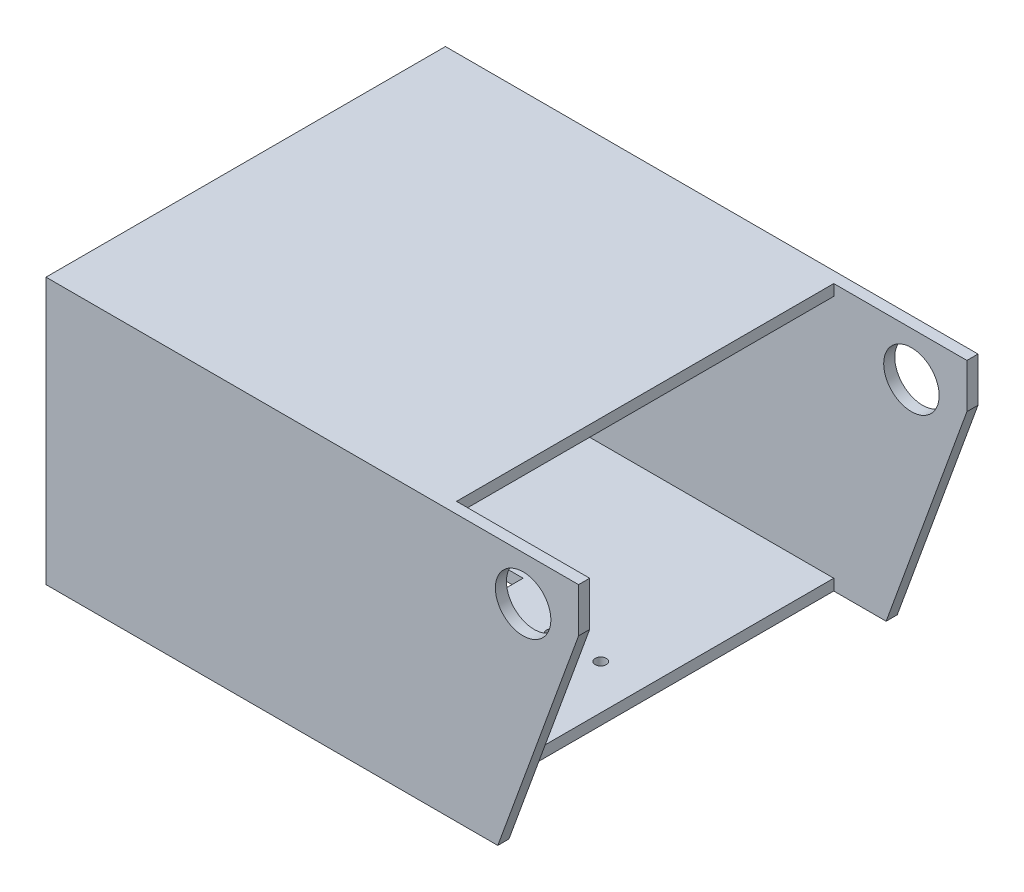
ISO-10303-21;
HEADER;
FILE_DESCRIPTION(('STEP AP214'),'2;1');
FILE_NAME('part.step','',(''),(''),'','','');
FILE_SCHEMA(('AUTOMOTIVE_DESIGN { 1 0 10303 214 1 1 1 1 }'));
ENDSEC;
DATA;
#1=APPLICATION_CONTEXT('core data for automotive mechanical design processes');
#2=APPLICATION_PROTOCOL_DEFINITION('international standard','automotive_design',2000,#1);
#3=PRODUCT_CONTEXT('',#1,'mechanical');
#4=PRODUCT('Part','Part','',(#3));
#5=PRODUCT_RELATED_PRODUCT_CATEGORY('part','',(#4));
#6=PRODUCT_DEFINITION_FORMATION('','',#4);
#7=PRODUCT_DEFINITION_CONTEXT('part definition',#1,'design');
#8=PRODUCT_DEFINITION('design','',#6,#7);
#9=PRODUCT_DEFINITION_SHAPE('','',#8);
#10=(LENGTH_UNIT() NAMED_UNIT(*) SI_UNIT(.MILLI.,.METRE.));
#11=(NAMED_UNIT(*) PLANE_ANGLE_UNIT() SI_UNIT($,.RADIAN.));
#12=(NAMED_UNIT(*) SI_UNIT($,.STERADIAN.) SOLID_ANGLE_UNIT());
#13=UNCERTAINTY_MEASURE_WITH_UNIT(LENGTH_MEASURE(1.E-05),#10,'distance_accuracy_value','');
#14=(GEOMETRIC_REPRESENTATION_CONTEXT(3) GLOBAL_UNCERTAINTY_ASSIGNED_CONTEXT((#13)) GLOBAL_UNIT_ASSIGNED_CONTEXT((#10,
#11,#12)) REPRESENTATION_CONTEXT('',''));
#15=CARTESIAN_POINT('',(0.,0.,0.));
#16=DIRECTION('',(0.,0.,1.));
#17=DIRECTION('',(1.,0.,0.));
#18=AXIS2_PLACEMENT_3D('',#15,#16,#17);
#19=CARTESIAN_POINT('',(17.18049689441,76.2,-41.5984161490683));
#20=DIRECTION('',(1.,0.,0.));
#21=DIRECTION('',(0.,0.,-1.));
#22=AXIS2_PLACEMENT_3D('',#19,#20,#21);
#23=PLANE('',#22);
#24=DIRECTION('',(0.,0.,1.));
#25=VECTOR('',#24,1.);
#26=CARTESIAN_POINT('',(17.18049689441,73.025,-41.5984161490683));
#27=LINE('',#26,#25);
#28=CARTESIAN_POINT('',(17.18049689441,73.025,-41.5984161490684));
#29=VERTEX_POINT('',#28);
#30=CARTESIAN_POINT('',(17.18049689441,73.025,66.3515838509316));
#31=VERTEX_POINT('',#30);
#32=EDGE_CURVE('E316',#29,#31,#27,.T.);
#33=ORIENTED_EDGE('',*,*,#32,.F.);
#34=DIRECTION('',(0.,-1.,0.));
#35=VECTOR('',#34,1.);
#36=CARTESIAN_POINT('',(17.18049689441,76.2,-41.5984161490683));
#37=LINE('',#36,#35);
#38=CARTESIAN_POINT('',(17.18049689441,76.2,-41.5984161490683));
#39=VERTEX_POINT('',#38);
#40=EDGE_CURVE('E252',#39,#29,#37,.T.);
#41=ORIENTED_EDGE('',*,*,#40,.F.);
#42=DIRECTION('',(0.,0.,1.));
#43=VECTOR('',#42,1.);
#44=CARTESIAN_POINT('',(17.18049689441,76.2,-41.5984161490683));
#45=LINE('',#44,#43);
#46=CARTESIAN_POINT('',(17.18049689441,76.2,66.3515838509317));
#47=VERTEX_POINT('',#46);
#48=EDGE_CURVE('E236',#39,#47,#45,.T.);
#49=ORIENTED_EDGE('',*,*,#48,.T.);
#50=DIRECTION('',(0.,-1.,0.));
#51=VECTOR('',#50,1.);
#52=CARTESIAN_POINT('',(17.18049689441,76.2,66.3515838509317));
#53=LINE('',#52,#51);
#54=EDGE_CURVE('E260',#47,#31,#53,.T.);
#55=ORIENTED_EDGE('',*,*,#54,.T.);
#56=EDGE_LOOP('',(#33,#41,#49,#55));
#57=FACE_BOUND('',#56,.T.);
#58=ADVANCED_FACE('F40',(#57),#23,.T.);
#59=CARTESIAN_POINT('',(55.2804968944099,76.2,-44.7734161490683));
#60=DIRECTION('',(-1.,0.,0.));
#61=DIRECTION('',(0.,0.,1.));
#62=AXIS2_PLACEMENT_3D('',#59,#60,#61);
#63=PLANE('',#62);
#64=DIRECTION('',(0.,-1.,0.));
#65=VECTOR('',#64,1.);
#66=CARTESIAN_POINT('',(55.28049689441,76.2,66.3515838509317));
#67=LINE('',#66,#65);
#68=CARTESIAN_POINT('',(55.28049689441,76.2,66.3515838509317));
#69=VERTEX_POINT('',#68);
#70=CARTESIAN_POINT('',(55.28049689441,63.5,66.3515838509317));
#71=VERTEX_POINT('',#70);
#72=EDGE_CURVE('E257',#69,#71,#67,.T.);
#73=ORIENTED_EDGE('',*,*,#72,.F.);
#74=DIRECTION('',(0.,0.,-1.));
#75=VECTOR('',#74,1.);
#76=CARTESIAN_POINT('',(55.2804968944099,76.2,-44.7734161490683));
#77=LINE('',#76,#75);
#78=CARTESIAN_POINT('',(55.28049689441,76.2,69.5265838509317));
#79=VERTEX_POINT('',#78);
#80=EDGE_CURVE('E285',#79,#69,#77,.T.);
#81=ORIENTED_EDGE('',*,*,#80,.F.);
#82=DIRECTION('',(0.,-1.,0.));
#83=VECTOR('',#82,1.);
#84=CARTESIAN_POINT('',(55.28049689441,76.2,69.5265838509317));
#85=LINE('',#84,#83);
#86=CARTESIAN_POINT('',(55.28049689441,63.5,69.5265838509317));
#87=VERTEX_POINT('',#86);
#88=EDGE_CURVE('E302',#79,#87,#85,.T.);
#89=ORIENTED_EDGE('',*,*,#88,.T.);
#90=DIRECTION('',(0.,0.,1.));
#91=VECTOR('',#90,1.);
#92=CARTESIAN_POINT('',(55.28049689441,63.5,-44.7734161490683));
#93=LINE('',#92,#91);
#94=EDGE_CURVE('E269',#71,#87,#93,.T.);
#95=ORIENTED_EDGE('',*,*,#94,.F.);
#96=EDGE_LOOP('',(#73,#81,#89,#95));
#97=FACE_BOUND('',#96,.T.);
#98=ADVANCED_FACE('F341',(#97),#63,.F.);
#99=CARTESIAN_POINT('',(0.,76.2,0.));
#100=DIRECTION('',(0.,1.,0.));
#101=DIRECTION('',(0.,0.,1.));
#102=AXIS2_PLACEMENT_3D('',#99,#100,#101);
#103=PLANE('',#102);
#104=ORIENTED_EDGE('',*,*,#80,.T.);
#105=DIRECTION('',(1.,0.,0.));
#106=VECTOR('',#105,1.);
#107=CARTESIAN_POINT('',(17.18049689441,76.2,66.3515838509317));
#108=LINE('',#107,#106);
#109=EDGE_CURVE('E238',#47,#69,#108,.T.);
#110=ORIENTED_EDGE('',*,*,#109,.F.);
#111=ORIENTED_EDGE('',*,*,#48,.F.);
#112=DIRECTION('',(1.,0.,0.));
#113=VECTOR('',#112,1.);
#114=CARTESIAN_POINT('',(17.18049689441,76.2,-41.5984161490683));
#115=LINE('',#114,#113);
#116=CARTESIAN_POINT('',(55.28049689441,76.2,-41.5984161490683));
#117=VERTEX_POINT('',#116);
#118=EDGE_CURVE('E241',#39,#117,#115,.T.);
#119=ORIENTED_EDGE('',*,*,#118,.T.);
#120=CARTESIAN_POINT('',(55.2804968944099,76.2,-44.7734161490683));
#121=VERTEX_POINT('',#120);
#122=EDGE_CURVE('E284',#117,#121,#77,.T.);
#123=ORIENTED_EDGE('',*,*,#122,.T.);
#124=DIRECTION('',(-1.,0.,0.));
#125=VECTOR('',#124,1.);
#126=CARTESIAN_POINT('',(-97.1195031055901,76.2,-44.7734161490683));
#127=LINE('',#126,#125);
#128=CARTESIAN_POINT('',(-97.1195031055901,76.2,-44.7734161490683));
#129=VERTEX_POINT('',#128);
#130=EDGE_CURVE('E288',#121,#129,#127,.T.);
#131=ORIENTED_EDGE('',*,*,#130,.T.);
#132=DIRECTION('',(0.,0.,1.));
#133=VECTOR('',#132,1.);
#134=CARTESIAN_POINT('',(-97.1195031055901,76.2,-44.7734161490683));
#135=LINE('',#134,#133);
#136=CARTESIAN_POINT('',(-97.11950310559,76.2,69.5265838509317));
#137=VERTEX_POINT('',#136);
#138=EDGE_CURVE('E278',#129,#137,#135,.T.);
#139=ORIENTED_EDGE('',*,*,#138,.T.);
#140=DIRECTION('',(1.,0.,0.));
#141=VECTOR('',#140,1.);
#142=CARTESIAN_POINT('',(-97.11950310559,76.2,69.5265838509317));
#143=LINE('',#142,#141);
#144=EDGE_CURVE('E281',#137,#79,#143,.T.);
#145=ORIENTED_EDGE('',*,*,#144,.T.);
#146=EDGE_LOOP('',(#104,#110,#111,#119,#123,#131,#139,#145));
#147=FACE_BOUND('',#146,.T.);
#148=ADVANCED_FACE('F348',(#147),#103,.T.);
#149=CARTESIAN_POINT('',(0.,0.,0.));
#150=DIRECTION('',(0.,1.,0.));
#151=DIRECTION('',(0.,0.,1.));
#152=AXIS2_PLACEMENT_3D('',#149,#150,#151);
#153=PLANE('',#152);
#154=DIRECTION('',(-1.,0.,0.));
#155=VECTOR('',#154,1.);
#156=CARTESIAN_POINT('',(-90.7695031055901,0.,21.9015838509317));
#157=LINE('',#156,#155);
#158=CARTESIAN_POINT('',(-27.2695031055901,0.,21.9015838509317));
#159=VERTEX_POINT('',#158);
#160=CARTESIAN_POINT('',(-90.7695031055901,0.,21.9015838509317));
#161=VERTEX_POINT('',#160);
#162=EDGE_CURVE('E177',#159,#161,#157,.T.);
#163=ORIENTED_EDGE('',*,*,#162,.F.);
#164=DIRECTION('',(0.,0.,1.));
#165=VECTOR('',#164,1.);
#166=CARTESIAN_POINT('',(-27.2695031055901,0.,21.9015838509317));
#167=LINE('',#166,#165);
#168=CARTESIAN_POINT('',(-27.2695031055901,0.,2.85158385093166));
#169=VERTEX_POINT('',#168);
#170=EDGE_CURVE('E55',#169,#159,#167,.T.);
#171=ORIENTED_EDGE('',*,*,#170,.F.);
#172=DIRECTION('',(1.,0.,0.));
#173=VECTOR('',#172,1.);
#174=CARTESIAN_POINT('',(-90.7695031055901,0.,2.85158385093166));
#175=LINE('',#174,#173);
#176=CARTESIAN_POINT('',(-90.7695031055901,0.,2.85158385093166));
#177=VERTEX_POINT('',#176);
#178=EDGE_CURVE('E184',#177,#169,#175,.T.);
#179=ORIENTED_EDGE('',*,*,#178,.F.);
#180=DIRECTION('',(0.,0.,-1.));
#181=VECTOR('',#180,1.);
#182=CARTESIAN_POINT('',(-90.7695031055901,0.,21.9015838509317));
#183=LINE('',#182,#181);
#184=EDGE_CURVE('E168',#161,#177,#183,.T.);
#185=ORIENTED_EDGE('',*,*,#184,.F.);
#186=EDGE_LOOP('',(#163,#171,#179,#185));
#187=FACE_BOUND('',#186,.T.);
#188=CARTESIAN_POINT('',(4.48049689440999,0.,12.3765838509317));
#189=DIRECTION('',(0.,-1.,0.));
#190=DIRECTION('',(0.,0.,-1.));
#191=AXIS2_PLACEMENT_3D('',#188,#189,#190);
#192=CIRCLE('',#191,1.5875);
#193=CARTESIAN_POINT('',(4.48049689440999,0.,10.7890838509317));
#194=VERTEX_POINT('',#193);
#195=EDGE_CURVE('E198',#194,#194,#192,.T.);
#196=ORIENTED_EDGE('',*,*,#195,.F.);
#197=EDGE_LOOP('',(#196));
#198=FACE_BOUND('',#197,.T.);
#199=CARTESIAN_POINT('',(-9.48950310559001,0.,12.3765838509317));
#200=DIRECTION('',(0.,-1.,0.));
#201=DIRECTION('',(0.,0.,-1.));
#202=AXIS2_PLACEMENT_3D('',#199,#200,#201);
#203=CIRCLE('',#202,1.5875);
#204=CARTESIAN_POINT('',(-9.48950310559001,0.,10.7890838509317));
#205=VERTEX_POINT('',#204);
#206=EDGE_CURVE('E191',#205,#205,#203,.T.);
#207=ORIENTED_EDGE('',*,*,#206,.F.);
#208=EDGE_LOOP('',(#207));
#209=FACE_BOUND('',#208,.T.);
#210=DIRECTION('',(1.,0.,0.));
#211=VECTOR('',#210,1.);
#212=CARTESIAN_POINT('',(17.18049689441,0.,66.3515838509317));
#213=LINE('',#212,#211);
#214=CARTESIAN_POINT('',(17.18049689441,0.,66.3515838509317));
#215=VERTEX_POINT('',#214);
#216=CARTESIAN_POINT('',(32.1683870185066,0.,66.3515838509317));
#217=VERTEX_POINT('',#216);
#218=EDGE_CURVE('E247',#215,#217,#213,.T.);
#219=ORIENTED_EDGE('',*,*,#218,.T.);
#220=DIRECTION('',(0.,0.,1.));
#221=VECTOR('',#220,1.);
#222=CARTESIAN_POINT('',(32.1683870185066,0.,-44.7734161490683));
#223=LINE('',#222,#221);
#224=CARTESIAN_POINT('',(32.1683870185066,0.,69.5265838509317));
#225=VERTEX_POINT('',#224);
#226=EDGE_CURVE('E274',#217,#225,#223,.T.);
#227=ORIENTED_EDGE('',*,*,#226,.T.);
#228=DIRECTION('',(1.,0.,0.));
#229=VECTOR('',#228,1.);
#230=CARTESIAN_POINT('',(-97.11950310559,0.,69.5265838509317));
#231=LINE('',#230,#229);
#232=CARTESIAN_POINT('',(-97.11950310559,0.,69.5265838509317));
#233=VERTEX_POINT('',#232);
#234=EDGE_CURVE('E293',#233,#225,#231,.T.);
#235=ORIENTED_EDGE('',*,*,#234,.F.);
#236=DIRECTION('',(0.,0.,1.));
#237=VECTOR('',#236,1.);
#238=CARTESIAN_POINT('',(-97.1195031055901,0.,-44.7734161490683));
#239=LINE('',#238,#237);
#240=CARTESIAN_POINT('',(-97.1195031055901,0.,-44.7734161490683));
#241=VERTEX_POINT('',#240);
#242=EDGE_CURVE('E273',#241,#233,#239,.T.);
#243=ORIENTED_EDGE('',*,*,#242,.F.);
#244=DIRECTION('',(-1.,0.,0.));
#245=VECTOR('',#244,1.);
#246=CARTESIAN_POINT('',(-97.1195031055901,0.,-44.7734161490683));
#247=LINE('',#246,#245);
#248=CARTESIAN_POINT('',(32.1683870185066,0.,-44.7734161490683));
#249=VERTEX_POINT('',#248);
#250=EDGE_CURVE('E282',#249,#241,#247,.T.);
#251=ORIENTED_EDGE('',*,*,#250,.F.);
#252=CARTESIAN_POINT('',(32.1683870185066,0.,-41.5984161490683));
#253=VERTEX_POINT('',#252);
#254=EDGE_CURVE('E270',#249,#253,#223,.T.);
#255=ORIENTED_EDGE('',*,*,#254,.T.);
#256=DIRECTION('',(1.,0.,0.));
#257=VECTOR('',#256,1.);
#258=CARTESIAN_POINT('',(17.18049689441,0.,-41.5984161490683));
#259=LINE('',#258,#257);
#260=CARTESIAN_POINT('',(17.18049689441,0.,-41.5984161490683));
#261=VERTEX_POINT('',#260);
#262=EDGE_CURVE('E239',#261,#253,#259,.T.);
#263=ORIENTED_EDGE('',*,*,#262,.F.);
#264=DIRECTION('',(0.,0.,1.));
#265=VECTOR('',#264,1.);
#266=CARTESIAN_POINT('',(17.18049689441,0.,-41.5984161490683));
#267=LINE('',#266,#265);
#268=EDGE_CURVE('E235',#261,#215,#267,.T.);
#269=ORIENTED_EDGE('',*,*,#268,.T.);
#270=EDGE_LOOP('',(#219,#227,#235,#243,#251,#255,#263,#269));
#271=FACE_BOUND('',#270,.T.);
#272=ADVANCED_FACE('F181',(#187,#198,#209,#271),#153,.F.);
#273=CARTESIAN_POINT('',(55.28049689441,63.5,-44.7734161490683));
#274=DIRECTION('',(-0.939692620785911,0.342020143325663,0.));
#275=DIRECTION('',(-0.342020143325663,-0.939692620785911,0.));
#276=AXIS2_PLACEMENT_3D('',#273,#274,#275);
#277=PLANE('',#276);
#278=DIRECTION('',(-0.342020143325663,-0.939692620785911,0.));
#279=VECTOR('',#278,1.);
#280=CARTESIAN_POINT('',(55.28049689441,63.5,66.3515838509317));
#281=LINE('',#280,#279);
#282=EDGE_CURVE('E310',#71,#217,#281,.T.);
#283=ORIENTED_EDGE('',*,*,#282,.F.);
#284=ORIENTED_EDGE('',*,*,#94,.T.);
#285=DIRECTION('',(-0.342020143325663,-0.939692620785911,0.));
#286=VECTOR('',#285,1.);
#287=CARTESIAN_POINT('',(55.28049689441,63.5,69.5265838509317));
#288=LINE('',#287,#286);
#289=EDGE_CURVE('E263',#87,#225,#288,.T.);
#290=ORIENTED_EDGE('',*,*,#289,.T.);
#291=ORIENTED_EDGE('',*,*,#226,.F.);
#292=EDGE_LOOP('',(#283,#284,#290,#291));
#293=FACE_BOUND('',#292,.T.);
#294=ADVANCED_FACE('F405',(#293),#277,.F.);
#295=CARTESIAN_POINT('',(-97.1195031055901,76.2,-44.7734161490683));
#296=DIRECTION('',(1.,0.,0.));
#297=DIRECTION('',(0.,0.,-1.));
#298=AXIS2_PLACEMENT_3D('',#295,#296,#297);
#299=PLANE('',#298);
#300=DIRECTION('',(0.,0.,1.));
#301=VECTOR('',#300,1.);
#302=CARTESIAN_POINT('',(-97.1195031055901,3.175,-41.5984161490683));
#303=LINE('',#302,#301);
#304=CARTESIAN_POINT('',(-97.1195031055901,3.175,-41.5984161490684));
#305=VERTEX_POINT('',#304);
#306=CARTESIAN_POINT('',(-97.11950310559,3.175,66.3515838509317));
#307=VERTEX_POINT('',#306);
#308=EDGE_CURVE('E207',#305,#307,#303,.T.);
#309=ORIENTED_EDGE('',*,*,#308,.F.);
#310=DIRECTION('',(0.,-1.,0.));
#311=VECTOR('',#310,1.);
#312=CARTESIAN_POINT('',(-97.1195031055901,73.025,-41.5984161490683));
#313=LINE('',#312,#311);
#314=CARTESIAN_POINT('',(-97.1195031055901,73.025,-41.5984161490683));
#315=VERTEX_POINT('',#314);
#316=EDGE_CURVE('E197',#315,#305,#313,.T.);
#317=ORIENTED_EDGE('',*,*,#316,.F.);
#318=DIRECTION('',(0.,0.,-1.));
#319=VECTOR('',#318,1.);
#320=CARTESIAN_POINT('',(-97.1195031055901,73.025,-41.5984161490683));
#321=LINE('',#320,#319);
#322=CARTESIAN_POINT('',(-97.11950310559,73.025,66.3515838509316));
#323=VERTEX_POINT('',#322);
#324=EDGE_CURVE('E213',#323,#315,#321,.T.);
#325=ORIENTED_EDGE('',*,*,#324,.F.);
#326=DIRECTION('',(0.,1.,0.));
#327=VECTOR('',#326,1.);
#328=CARTESIAN_POINT('',(-97.11950310559,73.025,66.3515838509316));
#329=LINE('',#328,#327);
#330=EDGE_CURVE('E210',#307,#323,#329,.T.);
#331=ORIENTED_EDGE('',*,*,#330,.F.);
#332=EDGE_LOOP('',(#309,#317,#325,#331));
#333=FACE_BOUND('',#332,.T.);
#334=ORIENTED_EDGE('',*,*,#242,.T.);
#335=DIRECTION('',(0.,-1.,0.));
#336=VECTOR('',#335,1.);
#337=CARTESIAN_POINT('',(-97.11950310559,76.2,69.5265838509317));
#338=LINE('',#337,#336);
#339=EDGE_CURVE('E305',#137,#233,#338,.T.);
#340=ORIENTED_EDGE('',*,*,#339,.F.);
#341=ORIENTED_EDGE('',*,*,#138,.F.);
#342=DIRECTION('',(0.,-1.,0.));
#343=VECTOR('',#342,1.);
#344=CARTESIAN_POINT('',(-97.1195031055901,76.2,-44.7734161490683));
#345=LINE('',#344,#343);
#346=EDGE_CURVE('E290',#129,#241,#345,.T.);
#347=ORIENTED_EDGE('',*,*,#346,.T.);
#348=EDGE_LOOP('',(#334,#340,#341,#347));
#349=FACE_BOUND('',#348,.T.);
#350=ADVANCED_FACE('F42',(#333,#349),#299,.F.);
#351=CARTESIAN_POINT('',(-97.11950310559,76.2,69.5265838509317));
#352=DIRECTION('',(0.,0.,-1.));
#353=DIRECTION('',(-1.,0.,0.));
#354=AXIS2_PLACEMENT_3D('',#351,#352,#353);
#355=PLANE('',#354);
#356=CARTESIAN_POINT('',(39.40549689441,63.5,69.5265838509317));
#357=DIRECTION('',(0.,0.,-1.));
#358=DIRECTION('',(-1.,0.,0.));
#359=AXIS2_PLACEMENT_3D('',#356,#357,#358);
#360=CIRCLE('',#359,7.9375);
#361=CARTESIAN_POINT('',(31.46799689441,63.5,69.5265838509317));
#362=VERTEX_POINT('',#361);
#363=EDGE_CURVE('E232',#362,#362,#360,.T.);
#364=ORIENTED_EDGE('',*,*,#363,.T.);
#365=EDGE_LOOP('',(#364));
#366=FACE_BOUND('',#365,.T.);
#367=ORIENTED_EDGE('',*,*,#234,.T.);
#368=ORIENTED_EDGE('',*,*,#289,.F.);
#369=ORIENTED_EDGE('',*,*,#88,.F.);
#370=ORIENTED_EDGE('',*,*,#144,.F.);
#371=ORIENTED_EDGE('',*,*,#339,.T.);
#372=EDGE_LOOP('',(#367,#368,#369,#370,#371));
#373=FACE_BOUND('',#372,.T.);
#374=ADVANCED_FACE('F407',(#366,#373),#355,.F.);
#375=ORIENTED_EDGE('',*,*,#122,.F.);
#376=DIRECTION('',(0.,-1.,0.));
#377=VECTOR('',#376,1.);
#378=CARTESIAN_POINT('',(55.28049689441,76.2,-41.5984161490683));
#379=LINE('',#378,#377);
#380=CARTESIAN_POINT('',(55.28049689441,63.5,-41.5984161490683));
#381=VERTEX_POINT('',#380);
#382=EDGE_CURVE('E255',#117,#381,#379,.T.);
#383=ORIENTED_EDGE('',*,*,#382,.T.);
#384=CARTESIAN_POINT('',(55.28049689441,63.5,-44.7734161490683));
#385=VERTEX_POINT('',#384);
#386=EDGE_CURVE('E275',#385,#381,#93,.T.);
#387=ORIENTED_EDGE('',*,*,#386,.F.);
#388=DIRECTION('',(0.,-1.,0.));
#389=VECTOR('',#388,1.);
#390=CARTESIAN_POINT('',(55.2804968944099,76.2,-44.7734161490683));
#391=LINE('',#390,#389);
#392=EDGE_CURVE('E299',#121,#385,#391,.T.);
#393=ORIENTED_EDGE('',*,*,#392,.F.);
#394=EDGE_LOOP('',(#375,#383,#387,#393));
#395=FACE_BOUND('',#394,.T.);
#396=ADVANCED_FACE('F351',(#395),#63,.F.);
#397=CARTESIAN_POINT('',(-97.1195031055901,76.2,-44.7734161490683));
#398=DIRECTION('',(0.,0.,1.));
#399=DIRECTION('',(1.,0.,0.));
#400=AXIS2_PLACEMENT_3D('',#397,#398,#399);
#401=PLANE('',#400);
#402=CARTESIAN_POINT('',(39.40549689441,63.5,-44.7734161490683));
#403=DIRECTION('',(0.,0.,1.));
#404=DIRECTION('',(1.,0.,0.));
#405=AXIS2_PLACEMENT_3D('',#402,#403,#404);
#406=CIRCLE('',#405,7.9375);
#407=CARTESIAN_POINT('',(47.34299689441,63.5,-44.7734161490683));
#408=VERTEX_POINT('',#407);
#409=EDGE_CURVE('E219',#408,#408,#406,.T.);
#410=ORIENTED_EDGE('',*,*,#409,.T.);
#411=EDGE_LOOP('',(#410));
#412=FACE_BOUND('',#411,.T.);
#413=ORIENTED_EDGE('',*,*,#392,.T.);
#414=DIRECTION('',(-0.342020143325663,-0.939692620785911,0.));
#415=VECTOR('',#414,1.);
#416=CARTESIAN_POINT('',(55.28049689441,63.5,-44.7734161490683));
#417=LINE('',#416,#415);
#418=EDGE_CURVE('E266',#385,#249,#417,.T.);
#419=ORIENTED_EDGE('',*,*,#418,.T.);
#420=ORIENTED_EDGE('',*,*,#250,.T.);
#421=ORIENTED_EDGE('',*,*,#346,.F.);
#422=ORIENTED_EDGE('',*,*,#130,.F.);
#423=EDGE_LOOP('',(#413,#419,#420,#421,#422));
#424=FACE_BOUND('',#423,.T.);
#425=ADVANCED_FACE('F414',(#412,#424),#401,.F.);
#426=ORIENTED_EDGE('',*,*,#386,.T.);
#427=DIRECTION('',(-0.342020143325663,-0.939692620785911,0.));
#428=VECTOR('',#427,1.);
#429=CARTESIAN_POINT('',(55.28049689441,63.5,-41.5984161490683));
#430=LINE('',#429,#428);
#431=EDGE_CURVE('E308',#381,#253,#430,.T.);
#432=ORIENTED_EDGE('',*,*,#431,.T.);
#433=ORIENTED_EDGE('',*,*,#254,.F.);
#434=ORIENTED_EDGE('',*,*,#418,.F.);
#435=EDGE_LOOP('',(#426,#432,#433,#434));
#436=FACE_BOUND('',#435,.T.);
#437=ADVANCED_FACE('F418',(#436),#277,.F.);
#438=CARTESIAN_POINT('',(17.18049689441,76.2,66.3515838509317));
#439=DIRECTION('',(0.,0.,-1.));
#440=DIRECTION('',(-1.,0.,0.));
#441=AXIS2_PLACEMENT_3D('',#438,#439,#440);
#442=PLANE('',#441);
#443=CARTESIAN_POINT('',(17.18049689441,3.17500000000003,66.3515838509317));
#444=VERTEX_POINT('',#443);
#445=EDGE_CURVE('E259',#444,#215,#53,.T.);
#446=ORIENTED_EDGE('',*,*,#445,.F.);
#447=DIRECTION('',(-1.,0.,0.));
#448=VECTOR('',#447,1.);
#449=CARTESIAN_POINT('',(55.28049689441,3.175,66.3515838509316));
#450=LINE('',#449,#448);
#451=EDGE_CURVE('E222',#444,#307,#450,.T.);
#452=ORIENTED_EDGE('',*,*,#451,.T.);
#453=ORIENTED_EDGE('',*,*,#330,.T.);
#454=DIRECTION('',(-1.,0.,0.));
#455=VECTOR('',#454,1.);
#456=CARTESIAN_POINT('',(55.28049689441,73.025,66.3515838509316));
#457=LINE('',#456,#455);
#458=EDGE_CURVE('E220',#31,#323,#457,.T.);
#459=ORIENTED_EDGE('',*,*,#458,.F.);
#460=ORIENTED_EDGE('',*,*,#54,.F.);
#461=ORIENTED_EDGE('',*,*,#109,.T.);
#462=ORIENTED_EDGE('',*,*,#72,.T.);
#463=ORIENTED_EDGE('',*,*,#282,.T.);
#464=ORIENTED_EDGE('',*,*,#218,.F.);
#465=EDGE_LOOP('',(#446,#452,#453,#459,#460,#461,#462,#463,#464));
#466=FACE_BOUND('',#465,.T.);
#467=CARTESIAN_POINT('',(39.40549689441,63.5,66.3515838509317));
#468=DIRECTION('',(0.,0.,-1.));
#469=DIRECTION('',(-1.,0.,0.));
#470=AXIS2_PLACEMENT_3D('',#467,#468,#469);
#471=CIRCLE('',#470,7.9375);
#472=CARTESIAN_POINT('',(31.46799689441,63.5,66.3515838509317));
#473=VERTEX_POINT('',#472);
#474=EDGE_CURVE('E229',#473,#473,#471,.T.);
#475=ORIENTED_EDGE('',*,*,#474,.F.);
#476=EDGE_LOOP('',(#475));
#477=FACE_BOUND('',#476,.T.);
#478=ADVANCED_FACE('F366',(#466,#477),#442,.T.);
#479=CARTESIAN_POINT('',(17.18049689441,76.2,-41.5984161490683));
#480=DIRECTION('',(0.,0.,-1.));
#481=DIRECTION('',(-1.,0.,0.));
#482=AXIS2_PLACEMENT_3D('',#479,#480,#481);
#483=PLANE('',#482);
#484=ORIENTED_EDGE('',*,*,#262,.T.);
#485=ORIENTED_EDGE('',*,*,#431,.F.);
#486=ORIENTED_EDGE('',*,*,#382,.F.);
#487=ORIENTED_EDGE('',*,*,#118,.F.);
#488=ORIENTED_EDGE('',*,*,#40,.T.);
#489=DIRECTION('',(-1.,0.,0.));
#490=VECTOR('',#489,1.);
#491=CARTESIAN_POINT('',(55.28049689441,73.025,-41.5984161490684));
#492=LINE('',#491,#490);
#493=EDGE_CURVE('E217',#29,#315,#492,.T.);
#494=ORIENTED_EDGE('',*,*,#493,.T.);
#495=ORIENTED_EDGE('',*,*,#316,.T.);
#496=DIRECTION('',(-1.,0.,0.));
#497=VECTOR('',#496,1.);
#498=CARTESIAN_POINT('',(55.28049689441,3.175,-41.5984161490684));
#499=LINE('',#498,#497);
#500=CARTESIAN_POINT('',(17.18049689441,3.175,-41.5984161490684));
#501=VERTEX_POINT('',#500);
#502=EDGE_CURVE('E216',#501,#305,#499,.T.);
#503=ORIENTED_EDGE('',*,*,#502,.F.);
#504=EDGE_CURVE('E244',#501,#261,#37,.T.);
#505=ORIENTED_EDGE('',*,*,#504,.T.);
#506=EDGE_LOOP('',(#484,#485,#486,#487,#488,#494,#495,#503,#505));
#507=FACE_BOUND('',#506,.T.);
#508=CARTESIAN_POINT('',(39.40549689441,63.5,-41.5984161490683));
#509=DIRECTION('',(0.,0.,-1.));
#510=DIRECTION('',(-1.,0.,0.));
#511=AXIS2_PLACEMENT_3D('',#508,#509,#510);
#512=CIRCLE('',#511,7.9375);
#513=CARTESIAN_POINT('',(31.46799689441,63.5,-41.5984161490683));
#514=VERTEX_POINT('',#513);
#515=EDGE_CURVE('E228',#514,#514,#512,.T.);
#516=ORIENTED_EDGE('',*,*,#515,.T.);
#517=EDGE_LOOP('',(#516));
#518=FACE_BOUND('',#517,.T.);
#519=ADVANCED_FACE('F357',(#507,#518),#483,.F.);
#520=DIRECTION('',(0.,0.,-1.));
#521=VECTOR('',#520,1.);
#522=CARTESIAN_POINT('',(17.18049689441,3.175,-41.5984161490683));
#523=LINE('',#522,#521);
#524=EDGE_CURVE('E312',#444,#501,#523,.T.);
#525=ORIENTED_EDGE('',*,*,#524,.F.);
#526=ORIENTED_EDGE('',*,*,#445,.T.);
#527=ORIENTED_EDGE('',*,*,#268,.F.);
#528=ORIENTED_EDGE('',*,*,#504,.F.);
#529=EDGE_LOOP('',(#525,#526,#527,#528));
#530=FACE_BOUND('',#529,.T.);
#531=ADVANCED_FACE('F344',(#530),#23,.T.);
#532=CARTESIAN_POINT('',(39.40549689441,63.5,-44.7734161490683));
#533=DIRECTION('',(0.,0.,1.));
#534=DIRECTION('',(1.,0.,0.));
#535=AXIS2_PLACEMENT_3D('',#532,#533,#534);
#536=CYLINDRICAL_SURFACE('',#535,7.9375);
#537=ORIENTED_EDGE('',*,*,#409,.F.);
#538=EDGE_LOOP('',(#537));
#539=FACE_BOUND('',#538,.T.);
#540=ORIENTED_EDGE('',*,*,#515,.F.);
#541=EDGE_LOOP('',(#540));
#542=FACE_BOUND('',#541,.T.);
#543=ADVANCED_FACE('F356',(#539,#542),#536,.F.);
#544=ORIENTED_EDGE('',*,*,#474,.T.);
#545=EDGE_LOOP('',(#544));
#546=FACE_BOUND('',#545,.T.);
#547=ORIENTED_EDGE('',*,*,#363,.F.);
#548=EDGE_LOOP('',(#547));
#549=FACE_BOUND('',#548,.T.);
#550=ADVANCED_FACE('F363',(#546,#549),#536,.F.);
#551=CARTESIAN_POINT('',(55.28049689441,73.025,-41.5984161490684));
#552=DIRECTION('',(0.,1.,0.));
#553=DIRECTION('',(0.,0.,1.));
#554=AXIS2_PLACEMENT_3D('',#551,#552,#553);
#555=PLANE('',#554);
#556=ORIENTED_EDGE('',*,*,#32,.T.);
#557=ORIENTED_EDGE('',*,*,#458,.T.);
#558=ORIENTED_EDGE('',*,*,#324,.T.);
#559=ORIENTED_EDGE('',*,*,#493,.F.);
#560=EDGE_LOOP('',(#556,#557,#558,#559));
#561=FACE_BOUND('',#560,.T.);
#562=ADVANCED_FACE('F420',(#561),#555,.F.);
#563=CARTESIAN_POINT('',(55.28049689441,3.175,-41.5984161490684));
#564=DIRECTION('',(0.,-1.,0.));
#565=DIRECTION('',(0.,0.,-1.));
#566=AXIS2_PLACEMENT_3D('',#563,#564,#565);
#567=PLANE('',#566);
#568=DIRECTION('',(1.,0.,0.));
#569=VECTOR('',#568,1.);
#570=CARTESIAN_POINT('',(55.28049689441,3.175,2.85158385093166));
#571=LINE('',#570,#569);
#572=CARTESIAN_POINT('',(-90.7695031055901,3.175,2.85158385093166));
#573=VERTEX_POINT('',#572);
#574=CARTESIAN_POINT('',(-27.2695031055901,3.175,2.85158385093166));
#575=VERTEX_POINT('',#574);
#576=EDGE_CURVE('E48',#573,#575,#571,.T.);
#577=ORIENTED_EDGE('',*,*,#576,.T.);
#578=DIRECTION('',(0.,0.,1.));
#579=VECTOR('',#578,1.);
#580=CARTESIAN_POINT('',(-27.2695031055901,3.175,-41.5984161490684));
#581=LINE('',#580,#579);
#582=CARTESIAN_POINT('',(-27.2695031055901,3.175,21.9015838509317));
#583=VERTEX_POINT('',#582);
#584=EDGE_CURVE('E11',#575,#583,#581,.T.);
#585=ORIENTED_EDGE('',*,*,#584,.T.);
#586=DIRECTION('',(-1.,0.,0.));
#587=VECTOR('',#586,1.);
#588=CARTESIAN_POINT('',(55.28049689441,3.175,21.9015838509317));
#589=LINE('',#588,#587);
#590=CARTESIAN_POINT('',(-90.7695031055901,3.175,21.9015838509317));
#591=VERTEX_POINT('',#590);
#592=EDGE_CURVE('E318',#583,#591,#589,.T.);
#593=ORIENTED_EDGE('',*,*,#592,.T.);
#594=DIRECTION('',(0.,0.,-1.));
#595=VECTOR('',#594,1.);
#596=CARTESIAN_POINT('',(-90.7695031055901,3.175,-41.5984161490684));
#597=LINE('',#596,#595);
#598=EDGE_CURVE('E171',#591,#573,#597,.T.);
#599=ORIENTED_EDGE('',*,*,#598,.T.);
#600=EDGE_LOOP('',(#577,#585,#593,#599));
#601=FACE_BOUND('',#600,.T.);
#602=CARTESIAN_POINT('',(4.48049689440999,3.175,12.3765838509317));
#603=DIRECTION('',(0.,-1.,0.));
#604=DIRECTION('',(0.,0.,-1.));
#605=AXIS2_PLACEMENT_3D('',#602,#603,#604);
#606=CIRCLE('',#605,1.5875);
#607=CARTESIAN_POINT('',(4.48049689440999,3.175,10.7890838509317));
#608=VERTEX_POINT('',#607);
#609=EDGE_CURVE('E194',#608,#608,#606,.T.);
#610=ORIENTED_EDGE('',*,*,#609,.T.);
#611=EDGE_LOOP('',(#610));
#612=FACE_BOUND('',#611,.T.);
#613=CARTESIAN_POINT('',(-9.48950310559001,3.175,12.3765838509317));
#614=DIRECTION('',(0.,-1.,0.));
#615=DIRECTION('',(0.,0.,-1.));
#616=AXIS2_PLACEMENT_3D('',#613,#614,#615);
#617=CIRCLE('',#616,1.5875);
#618=CARTESIAN_POINT('',(-9.48950310559001,3.175,10.7890838509317));
#619=VERTEX_POINT('',#618);
#620=EDGE_CURVE('E201',#619,#619,#617,.T.);
#621=ORIENTED_EDGE('',*,*,#620,.T.);
#622=EDGE_LOOP('',(#621));
#623=FACE_BOUND('',#622,.T.);
#624=ORIENTED_EDGE('',*,*,#524,.T.);
#625=ORIENTED_EDGE('',*,*,#502,.T.);
#626=ORIENTED_EDGE('',*,*,#308,.T.);
#627=ORIENTED_EDGE('',*,*,#451,.F.);
#628=EDGE_LOOP('',(#624,#625,#626,#627));
#629=FACE_BOUND('',#628,.T.);
#630=ADVANCED_FACE('F322',(#601,#612,#623,#629),#567,.F.);
#631=CARTESIAN_POINT('',(-9.48950310559001,3.175,12.3765838509317));
#632=DIRECTION('',(0.,-1.,0.));
#633=DIRECTION('',(0.,0.,-1.));
#634=AXIS2_PLACEMENT_3D('',#631,#632,#633);
#635=CYLINDRICAL_SURFACE('',#634,1.5875);
#636=ORIENTED_EDGE('',*,*,#620,.F.);
#637=EDGE_LOOP('',(#636));
#638=FACE_BOUND('',#637,.T.);
#639=ORIENTED_EDGE('',*,*,#206,.T.);
#640=EDGE_LOOP('',(#639));
#641=FACE_BOUND('',#640,.T.);
#642=ADVANCED_FACE('F336',(#638,#641),#635,.F.);
#643=CARTESIAN_POINT('',(4.48049689440999,3.175,12.3765838509317));
#644=DIRECTION('',(0.,-1.,0.));
#645=DIRECTION('',(0.,0.,-1.));
#646=AXIS2_PLACEMENT_3D('',#643,#644,#645);
#647=CYLINDRICAL_SURFACE('',#646,1.5875);
#648=ORIENTED_EDGE('',*,*,#609,.F.);
#649=EDGE_LOOP('',(#648));
#650=FACE_BOUND('',#649,.T.);
#651=ORIENTED_EDGE('',*,*,#195,.T.);
#652=EDGE_LOOP('',(#651));
#653=FACE_BOUND('',#652,.T.);
#654=ADVANCED_FACE('F329',(#650,#653),#647,.F.);
#655=CARTESIAN_POINT('',(-27.2695031055901,5.715,21.9015838509317));
#656=DIRECTION('',(1.,0.,0.));
#657=DIRECTION('',(0.,0.,-1.));
#658=AXIS2_PLACEMENT_3D('',#655,#656,#657);
#659=PLANE('',#658);
#660=DIRECTION('',(0.,-1.,0.));
#661=VECTOR('',#660,1.);
#662=CARTESIAN_POINT('',(-27.2695031055901,5.715,2.85158385093166));
#663=LINE('',#662,#661);
#664=EDGE_CURVE('E189',#575,#169,#663,.T.);
#665=ORIENTED_EDGE('',*,*,#664,.T.);
#666=ORIENTED_EDGE('',*,*,#170,.T.);
#667=DIRECTION('',(0.,-1.,0.));
#668=VECTOR('',#667,1.);
#669=CARTESIAN_POINT('',(-27.2695031055901,5.715,21.9015838509317));
#670=LINE('',#669,#668);
#671=EDGE_CURVE('E174',#583,#159,#670,.T.);
#672=ORIENTED_EDGE('',*,*,#671,.F.);
#673=ORIENTED_EDGE('',*,*,#584,.F.);
#674=EDGE_LOOP('',(#665,#666,#672,#673));
#675=FACE_BOUND('',#674,.T.);
#676=ADVANCED_FACE('F327',(#675),#659,.F.);
#677=CARTESIAN_POINT('',(-90.7695031055901,5.715,2.85158385093166));
#678=DIRECTION('',(0.,0.,-1.));
#679=DIRECTION('',(-1.,0.,0.));
#680=AXIS2_PLACEMENT_3D('',#677,#678,#679);
#681=PLANE('',#680);
#682=DIRECTION('',(0.,-1.,0.));
#683=VECTOR('',#682,1.);
#684=CARTESIAN_POINT('',(-90.7695031055901,5.715,2.85158385093166));
#685=LINE('',#684,#683);
#686=EDGE_CURVE('E173',#573,#177,#685,.T.);
#687=ORIENTED_EDGE('',*,*,#686,.T.);
#688=ORIENTED_EDGE('',*,*,#178,.T.);
#689=ORIENTED_EDGE('',*,*,#664,.F.);
#690=ORIENTED_EDGE('',*,*,#576,.F.);
#691=EDGE_LOOP('',(#687,#688,#689,#690));
#692=FACE_BOUND('',#691,.T.);
#693=ADVANCED_FACE('F326',(#692),#681,.F.);
#694=CARTESIAN_POINT('',(-90.7695031055901,5.715,21.9015838509317));
#695=DIRECTION('',(-1.,0.,0.));
#696=DIRECTION('',(0.,0.,1.));
#697=AXIS2_PLACEMENT_3D('',#694,#695,#696);
#698=PLANE('',#697);
#699=DIRECTION('',(0.,-1.,0.));
#700=VECTOR('',#699,1.);
#701=CARTESIAN_POINT('',(-90.7695031055901,5.715,21.9015838509317));
#702=LINE('',#701,#700);
#703=EDGE_CURVE('E63',#591,#161,#702,.T.);
#704=ORIENTED_EDGE('',*,*,#703,.T.);
#705=ORIENTED_EDGE('',*,*,#184,.T.);
#706=ORIENTED_EDGE('',*,*,#686,.F.);
#707=ORIENTED_EDGE('',*,*,#598,.F.);
#708=EDGE_LOOP('',(#704,#705,#706,#707));
#709=FACE_BOUND('',#708,.T.);
#710=ADVANCED_FACE('F165',(#709),#698,.F.);
#711=CARTESIAN_POINT('',(-90.7695031055901,5.715,21.9015838509317));
#712=DIRECTION('',(0.,0.,1.));
#713=DIRECTION('',(1.,0.,0.));
#714=AXIS2_PLACEMENT_3D('',#711,#712,#713);
#715=PLANE('',#714);
#716=ORIENTED_EDGE('',*,*,#671,.T.);
#717=ORIENTED_EDGE('',*,*,#162,.T.);
#718=ORIENTED_EDGE('',*,*,#703,.F.);
#719=ORIENTED_EDGE('',*,*,#592,.F.);
#720=EDGE_LOOP('',(#716,#717,#718,#719));
#721=FACE_BOUND('',#720,.T.);
#722=ADVANCED_FACE('F178',(#721),#715,.F.);
#723=CLOSED_SHELL('',(#58,#98,#148,#272,#294,#350,#374,#396,#425,#437,#478,#519,#531,#543,#550,
#562,#630,#642,#654,#676,#693,#710,#722));
#724=MANIFOLD_SOLID_BREP('B2',#723);
#725=ADVANCED_BREP_SHAPE_REPRESENTATION('',(#18,#724),#14);
#726=SHAPE_DEFINITION_REPRESENTATION(#9,#725);
ENDSEC;
END-ISO-10303-21;
